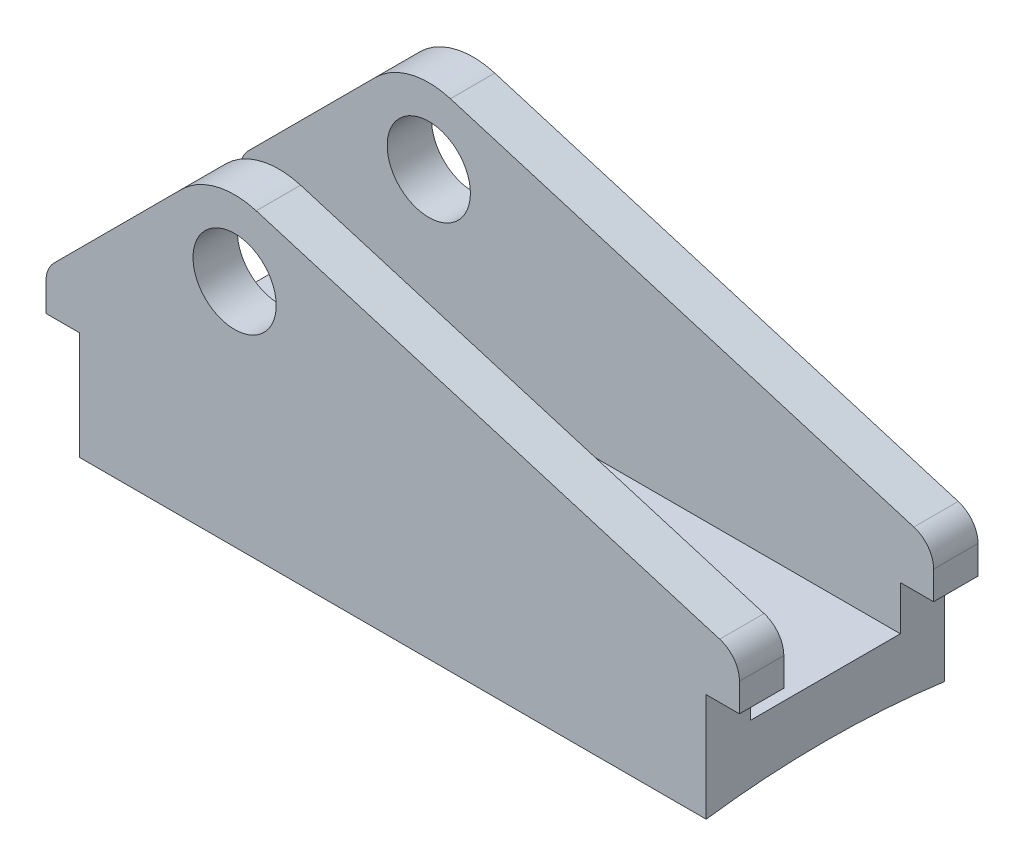
ISO-10303-21;
HEADER;
FILE_DESCRIPTION(('STEP AP214'),'2;1');
FILE_NAME('part.step','',(''),(''),'','','');
FILE_SCHEMA(('AUTOMOTIVE_DESIGN { 1 0 10303 214 1 1 1 1 }'));
ENDSEC;
DATA;
#1=APPLICATION_CONTEXT('core data for automotive mechanical design processes');
#2=APPLICATION_PROTOCOL_DEFINITION('international standard','automotive_design',2000,#1);
#3=PRODUCT_CONTEXT('',#1,'mechanical');
#4=PRODUCT('Part','Part','',(#3));
#5=PRODUCT_RELATED_PRODUCT_CATEGORY('part','',(#4));
#6=PRODUCT_DEFINITION_FORMATION('','',#4);
#7=PRODUCT_DEFINITION_CONTEXT('part definition',#1,'design');
#8=PRODUCT_DEFINITION('design','',#6,#7);
#9=PRODUCT_DEFINITION_SHAPE('','',#8);
#10=(LENGTH_UNIT() NAMED_UNIT(*) SI_UNIT(.MILLI.,.METRE.));
#11=(NAMED_UNIT(*) PLANE_ANGLE_UNIT() SI_UNIT($,.RADIAN.));
#12=(NAMED_UNIT(*) SI_UNIT($,.STERADIAN.) SOLID_ANGLE_UNIT());
#13=UNCERTAINTY_MEASURE_WITH_UNIT(LENGTH_MEASURE(1.E-05),#10,'distance_accuracy_value','');
#14=(GEOMETRIC_REPRESENTATION_CONTEXT(3) GLOBAL_UNCERTAINTY_ASSIGNED_CONTEXT((#13)) GLOBAL_UNIT_ASSIGNED_CONTEXT((#10,
#11,#12)) REPRESENTATION_CONTEXT('',''));
#15=CARTESIAN_POINT('',(0.,0.,0.));
#16=DIRECTION('',(0.,0.,1.));
#17=DIRECTION('',(1.,0.,0.));
#18=AXIS2_PLACEMENT_3D('',#15,#16,#17);
#19=CARTESIAN_POINT('',(56.5,10.,21.5));
#20=DIRECTION('',(-1.,0.,0.));
#21=DIRECTION('',(0.,0.,1.));
#22=AXIS2_PLACEMENT_3D('',#19,#20,#21);
#23=PLANE('',#22);
#24=CARTESIAN_POINT('',(56.5,-160.,0.));
#25=DIRECTION('',(1.,0.,0.));
#26=DIRECTION('',(0.,0.,-1.));
#27=AXIS2_PLACEMENT_3D('',#24,#25,#26);
#28=CIRCLE('',#27,160.);
#29=CARTESIAN_POINT('',(56.5,-1.45111164060469,-21.5));
#30=VERTEX_POINT('',#29);
#31=CARTESIAN_POINT('',(56.5,-1.45111164060469,21.5));
#32=VERTEX_POINT('',#31);
#33=EDGE_CURVE('E54',#30,#32,#28,.T.);
#34=ORIENTED_EDGE('',*,*,#33,.F.);
#35=DIRECTION('',(0.,-1.,0.));
#36=VECTOR('',#35,1.);
#37=CARTESIAN_POINT('',(56.5,10.,-21.5));
#38=LINE('',#37,#36);
#39=CARTESIAN_POINT('',(56.5,18.,-21.5));
#40=VERTEX_POINT('',#39);
#41=EDGE_CURVE('E209',#40,#30,#38,.T.);
#42=ORIENTED_EDGE('',*,*,#41,.F.);
#43=DIRECTION('',(0.,0.,-1.));
#44=VECTOR('',#43,1.);
#45=CARTESIAN_POINT('',(56.5,18.,-13.5));
#46=LINE('',#45,#44);
#47=CARTESIAN_POINT('',(56.5,18.,-13.5));
#48=VERTEX_POINT('',#47);
#49=EDGE_CURVE('E319',#48,#40,#46,.T.);
#50=ORIENTED_EDGE('',*,*,#49,.F.);
#51=DIRECTION('',(0.,1.,0.));
#52=VECTOR('',#51,1.);
#53=CARTESIAN_POINT('',(56.5,0.,-13.5));
#54=LINE('',#53,#52);
#55=CARTESIAN_POINT('',(56.5,10.,-13.5));
#56=VERTEX_POINT('',#55);
#57=EDGE_CURVE('E353',#56,#48,#54,.T.);
#58=ORIENTED_EDGE('',*,*,#57,.F.);
#59=DIRECTION('',(0.,0.,-1.));
#60=VECTOR('',#59,1.);
#61=CARTESIAN_POINT('',(56.5,10.,21.5));
#62=LINE('',#61,#60);
#63=CARTESIAN_POINT('',(56.5,10.,13.5));
#64=VERTEX_POINT('',#63);
#65=EDGE_CURVE('E232',#64,#56,#62,.T.);
#66=ORIENTED_EDGE('',*,*,#65,.F.);
#67=DIRECTION('',(0.,1.,0.));
#68=VECTOR('',#67,1.);
#69=CARTESIAN_POINT('',(56.5,0.,13.5));
#70=LINE('',#69,#68);
#71=CARTESIAN_POINT('',(56.5,18.,13.5));
#72=VERTEX_POINT('',#71);
#73=EDGE_CURVE('E256',#64,#72,#70,.T.);
#74=ORIENTED_EDGE('',*,*,#73,.T.);
#75=DIRECTION('',(0.,0.,1.));
#76=VECTOR('',#75,1.);
#77=CARTESIAN_POINT('',(56.5,18.,13.5));
#78=LINE('',#77,#76);
#79=CARTESIAN_POINT('',(56.5,18.,21.5));
#80=VERTEX_POINT('',#79);
#81=EDGE_CURVE('E231',#72,#80,#78,.T.);
#82=ORIENTED_EDGE('',*,*,#81,.T.);
#83=DIRECTION('',(0.,-1.,0.));
#84=VECTOR('',#83,1.);
#85=CARTESIAN_POINT('',(56.5,10.,21.5));
#86=LINE('',#85,#84);
#87=EDGE_CURVE('E213',#80,#32,#86,.T.);
#88=ORIENTED_EDGE('',*,*,#87,.T.);
#89=EDGE_LOOP('',(#34,#42,#50,#58,#66,#74,#82,#88));
#90=FACE_BOUND('',#89,.T.);
#91=ADVANCED_FACE('F41',(#90),#23,.F.);
#92=CARTESIAN_POINT('',(0.,10.,0.));
#93=DIRECTION('',(0.,-1.,0.));
#94=DIRECTION('',(0.,0.,-1.));
#95=AXIS2_PLACEMENT_3D('',#92,#93,#94);
#96=PLANE('',#95);
#97=DIRECTION('',(1.,0.,0.));
#98=VECTOR('',#97,1.);
#99=CARTESIAN_POINT('',(0.,10.,-13.5));
#100=LINE('',#99,#98);
#101=CARTESIAN_POINT('',(-56.5,10.,-13.5));
#102=VERTEX_POINT('',#101);
#103=EDGE_CURVE('E65',#102,#56,#100,.T.);
#104=ORIENTED_EDGE('',*,*,#103,.F.);
#105=DIRECTION('',(0.,0.,1.));
#106=VECTOR('',#105,1.);
#107=CARTESIAN_POINT('',(-56.5,10.,21.5));
#108=LINE('',#107,#106);
#109=CARTESIAN_POINT('',(-56.5,10.,13.5));
#110=VERTEX_POINT('',#109);
#111=EDGE_CURVE('E227',#102,#110,#108,.T.);
#112=ORIENTED_EDGE('',*,*,#111,.T.);
#113=DIRECTION('',(-1.,0.,0.));
#114=VECTOR('',#113,1.);
#115=CARTESIAN_POINT('',(0.,10.,13.5));
#116=LINE('',#115,#114);
#117=EDGE_CURVE('E48',#64,#110,#116,.T.);
#118=ORIENTED_EDGE('',*,*,#117,.F.);
#119=ORIENTED_EDGE('',*,*,#65,.T.);
#120=EDGE_LOOP('',(#104,#112,#118,#119));
#121=FACE_BOUND('',#120,.T.);
#122=ADVANCED_FACE('F415',(#121),#96,.F.);
#123=CARTESIAN_POINT('',(-56.5,10.,-21.5));
#124=DIRECTION('',(0.,0.,1.));
#125=DIRECTION('',(1.,0.,0.));
#126=AXIS2_PLACEMENT_3D('',#123,#124,#125);
#127=PLANE('',#126);
#128=ORIENTED_EDGE('',*,*,#41,.T.);
#129=DIRECTION('',(1.,0.,0.));
#130=VECTOR('',#129,1.);
#131=CARTESIAN_POINT('',(-62.5,-1.45111164060469,-21.5));
#132=LINE('',#131,#130);
#133=CARTESIAN_POINT('',(-56.5,-1.45111164060469,-21.5));
#134=VERTEX_POINT('',#133);
#135=EDGE_CURVE('E196',#30,#134,#132,.F.);
#136=ORIENTED_EDGE('',*,*,#135,.T.);
#137=DIRECTION('',(0.,-1.,0.));
#138=VECTOR('',#137,1.);
#139=CARTESIAN_POINT('',(-56.5,10.,-21.5));
#140=LINE('',#139,#138);
#141=CARTESIAN_POINT('',(-56.5,18.,-21.5));
#142=VERTEX_POINT('',#141);
#143=EDGE_CURVE('E219',#142,#134,#140,.T.);
#144=ORIENTED_EDGE('',*,*,#143,.F.);
#145=DIRECTION('',(1.,0.,0.));
#146=VECTOR('',#145,1.);
#147=CARTESIAN_POINT('',(-56.5,18.,-21.5));
#148=LINE('',#147,#146);
#149=CARTESIAN_POINT('',(-62.5,18.,-21.5));
#150=VERTEX_POINT('',#149);
#151=EDGE_CURVE('E368',#150,#142,#148,.T.);
#152=ORIENTED_EDGE('',*,*,#151,.F.);
#153=DIRECTION('',(0.,-1.,0.));
#154=VECTOR('',#153,1.);
#155=CARTESIAN_POINT('',(-62.5,18.,-21.5));
#156=LINE('',#155,#154);
#157=CARTESIAN_POINT('',(-62.5,23.0915259582902,-21.5));
#158=VERTEX_POINT('',#157);
#159=EDGE_CURVE('E365',#158,#150,#156,.T.);
#160=ORIENTED_EDGE('',*,*,#159,.F.);
#161=CARTESIAN_POINT('',(-57.5,23.0915259582902,-21.5));
#162=DIRECTION('',(0.,0.,1.));
#163=DIRECTION('',(1.,0.,0.));
#164=AXIS2_PLACEMENT_3D('',#161,#162,#163);
#165=CIRCLE('',#164,5.);
#166=CARTESIAN_POINT('',(-61.0355339059327,26.6270598642229,-21.5));
#167=VERTEX_POINT('',#166);
#168=EDGE_CURVE('E362',#167,#158,#165,.T.);
#169=ORIENTED_EDGE('',*,*,#168,.F.);
#170=DIRECTION('',(-0.707106781186551,-0.707106781186544,0.));
#171=VECTOR('',#170,1.);
#172=CARTESIAN_POINT('',(-61.0355339059327,26.6270598642229,-21.5));
#173=LINE('',#172,#171);
#174=CARTESIAN_POINT('',(-38.0812968850776,49.5812968850777,-21.5));
#175=VERTEX_POINT('',#174);
#176=EDGE_CURVE('E358',#175,#167,#173,.T.);
#177=ORIENTED_EDGE('',*,*,#176,.F.);
#178=CARTESIAN_POINT('',(-28.5,40.,-21.5));
#179=DIRECTION('',(0.,0.,1.));
#180=DIRECTION('',(-1.,0.,0.));
#181=AXIS2_PLACEMENT_3D('',#178,#179,#180);
#182=CIRCLE('',#181,13.55);
#183=CARTESIAN_POINT('',(-24.6014576766685,52.9770515816649,-21.5));
#184=VERTEX_POINT('',#183);
#185=EDGE_CURVE('E359',#184,#175,#182,.T.);
#186=ORIENTED_EDGE('',*,*,#185,.F.);
#187=DIRECTION('',(-0.957715983886712,0.287715300614872,0.));
#188=VECTOR('',#187,1.);
#189=CARTESIAN_POINT('',(58.9385765030744,27.8801058777238,-21.5));
#190=LINE('',#189,#188);
#191=CARTESIAN_POINT('',(58.9385765030744,27.8801058777238,-21.5));
#192=VERTEX_POINT('',#191);
#193=EDGE_CURVE('E357',#192,#184,#190,.T.);
#194=ORIENTED_EDGE('',*,*,#193,.F.);
#195=CARTESIAN_POINT('',(57.5,23.0915259582902,-21.5));
#196=DIRECTION('',(0.,0.,1.));
#197=DIRECTION('',(1.,0.,0.));
#198=AXIS2_PLACEMENT_3D('',#195,#196,#197);
#199=CIRCLE('',#198,4.99999999999999);
#200=CARTESIAN_POINT('',(62.5,23.0915259582902,-21.5));
#201=VERTEX_POINT('',#200);
#202=EDGE_CURVE('E352',#201,#192,#199,.T.);
#203=ORIENTED_EDGE('',*,*,#202,.F.);
#204=DIRECTION('',(0.,1.,0.));
#205=VECTOR('',#204,1.);
#206=CARTESIAN_POINT('',(62.5,18.,-21.5));
#207=LINE('',#206,#205);
#208=CARTESIAN_POINT('',(62.5,18.,-21.5));
#209=VERTEX_POINT('',#208);
#210=EDGE_CURVE('E355',#209,#201,#207,.T.);
#211=ORIENTED_EDGE('',*,*,#210,.F.);
#212=DIRECTION('',(1.,0.,0.));
#213=VECTOR('',#212,1.);
#214=CARTESIAN_POINT('',(56.5,18.,-21.5));
#215=LINE('',#214,#213);
#216=EDGE_CURVE('E217',#40,#209,#215,.T.);
#217=ORIENTED_EDGE('',*,*,#216,.F.);
#218=EDGE_LOOP('',(#128,#136,#144,#152,#160,#169,#177,#186,#194,#203,#211,#217));
#219=FACE_BOUND('',#218,.T.);
#220=CARTESIAN_POINT('',(-28.5,40.,-21.5));
#221=DIRECTION('',(0.,0.,1.));
#222=DIRECTION('',(1.,0.,0.));
#223=AXIS2_PLACEMENT_3D('',#220,#221,#222);
#224=CIRCLE('',#223,7.5);
#225=CARTESIAN_POINT('',(-21.,40.,-21.5));
#226=VERTEX_POINT('',#225);
#227=EDGE_CURVE('E202',#226,#226,#224,.T.);
#228=ORIENTED_EDGE('',*,*,#227,.T.);
#229=EDGE_LOOP('',(#228));
#230=FACE_BOUND('',#229,.T.);
#231=ADVANCED_FACE('F214',(#219,#230),#127,.F.);
#232=CARTESIAN_POINT('',(-56.5,10.,21.5));
#233=DIRECTION('',(1.,0.,0.));
#234=DIRECTION('',(0.,0.,-1.));
#235=AXIS2_PLACEMENT_3D('',#232,#233,#234);
#236=PLANE('',#235);
#237=ORIENTED_EDGE('',*,*,#143,.T.);
#238=CARTESIAN_POINT('',(-56.5,-160.,0.));
#239=DIRECTION('',(1.,0.,0.));
#240=DIRECTION('',(0.,0.,-1.));
#241=AXIS2_PLACEMENT_3D('',#238,#239,#240);
#242=CIRCLE('',#241,160.);
#243=CARTESIAN_POINT('',(-56.5,-1.45111164060469,21.5));
#244=VERTEX_POINT('',#243);
#245=EDGE_CURVE('E203',#134,#244,#242,.T.);
#246=ORIENTED_EDGE('',*,*,#245,.T.);
#247=DIRECTION('',(0.,-1.,0.));
#248=VECTOR('',#247,1.);
#249=CARTESIAN_POINT('',(-56.5,10.,21.5));
#250=LINE('',#249,#248);
#251=CARTESIAN_POINT('',(-56.5,18.,21.5));
#252=VERTEX_POINT('',#251);
#253=EDGE_CURVE('E224',#252,#244,#250,.T.);
#254=ORIENTED_EDGE('',*,*,#253,.F.);
#255=DIRECTION('',(0.,0.,1.));
#256=VECTOR('',#255,1.);
#257=CARTESIAN_POINT('',(-56.5,18.,13.5));
#258=LINE('',#257,#256);
#259=CARTESIAN_POINT('',(-56.5,18.,13.5));
#260=VERTEX_POINT('',#259);
#261=EDGE_CURVE('E234',#260,#252,#258,.T.);
#262=ORIENTED_EDGE('',*,*,#261,.F.);
#263=DIRECTION('',(0.,-1.,0.));
#264=VECTOR('',#263,1.);
#265=CARTESIAN_POINT('',(-56.5,0.,13.5));
#266=LINE('',#265,#264);
#267=EDGE_CURVE('E240',#260,#110,#266,.T.);
#268=ORIENTED_EDGE('',*,*,#267,.T.);
#269=ORIENTED_EDGE('',*,*,#111,.F.);
#270=DIRECTION('',(0.,-1.,0.));
#271=VECTOR('',#270,1.);
#272=CARTESIAN_POINT('',(-56.5,0.,-13.5));
#273=LINE('',#272,#271);
#274=CARTESIAN_POINT('',(-56.5,18.,-13.5));
#275=VERTEX_POINT('',#274);
#276=EDGE_CURVE('E390',#275,#102,#273,.T.);
#277=ORIENTED_EDGE('',*,*,#276,.F.);
#278=DIRECTION('',(0.,0.,-1.));
#279=VECTOR('',#278,1.);
#280=CARTESIAN_POINT('',(-56.5,18.,-13.5));
#281=LINE('',#280,#279);
#282=EDGE_CURVE('E321',#275,#142,#281,.T.);
#283=ORIENTED_EDGE('',*,*,#282,.T.);
#284=EDGE_LOOP('',(#237,#246,#254,#262,#268,#269,#277,#283));
#285=FACE_BOUND('',#284,.T.);
#286=ADVANCED_FACE('F397',(#285),#236,.F.);
#287=CARTESIAN_POINT('',(-56.5,10.,21.5));
#288=DIRECTION('',(0.,0.,-1.));
#289=DIRECTION('',(-1.,0.,0.));
#290=AXIS2_PLACEMENT_3D('',#287,#288,#289);
#291=PLANE('',#290);
#292=ORIENTED_EDGE('',*,*,#253,.T.);
#293=DIRECTION('',(1.,0.,0.));
#294=VECTOR('',#293,1.);
#295=CARTESIAN_POINT('',(-62.5,-1.45111164060469,21.5));
#296=LINE('',#295,#294);
#297=EDGE_CURVE('E11',#244,#32,#296,.T.);
#298=ORIENTED_EDGE('',*,*,#297,.T.);
#299=ORIENTED_EDGE('',*,*,#87,.F.);
#300=DIRECTION('',(1.,0.,0.));
#301=VECTOR('',#300,1.);
#302=CARTESIAN_POINT('',(56.5,18.,21.5));
#303=LINE('',#302,#301);
#304=CARTESIAN_POINT('',(62.5,18.,21.5));
#305=VERTEX_POINT('',#304);
#306=EDGE_CURVE('E278',#80,#305,#303,.T.);
#307=ORIENTED_EDGE('',*,*,#306,.T.);
#308=DIRECTION('',(0.,1.,0.));
#309=VECTOR('',#308,1.);
#310=CARTESIAN_POINT('',(62.5,18.,21.5));
#311=LINE('',#310,#309);
#312=CARTESIAN_POINT('',(62.5,23.0915259582902,21.5));
#313=VERTEX_POINT('',#312);
#314=EDGE_CURVE('E280',#305,#313,#311,.T.);
#315=ORIENTED_EDGE('',*,*,#314,.T.);
#316=CARTESIAN_POINT('',(57.5,23.0915259582902,21.5));
#317=DIRECTION('',(0.,0.,1.));
#318=DIRECTION('',(1.,0.,0.));
#319=AXIS2_PLACEMENT_3D('',#316,#317,#318);
#320=CIRCLE('',#319,4.99999999999999);
#321=CARTESIAN_POINT('',(58.9385765030744,27.8801058777238,21.5));
#322=VERTEX_POINT('',#321);
#323=EDGE_CURVE('E273',#313,#322,#320,.T.);
#324=ORIENTED_EDGE('',*,*,#323,.T.);
#325=DIRECTION('',(-0.957715983886712,0.287715300614872,0.));
#326=VECTOR('',#325,1.);
#327=CARTESIAN_POINT('',(58.9385765030744,27.8801058777238,21.5));
#328=LINE('',#327,#326);
#329=CARTESIAN_POINT('',(-24.6014576766685,52.9770515816649,21.5));
#330=VERTEX_POINT('',#329);
#331=EDGE_CURVE('E271',#322,#330,#328,.T.);
#332=ORIENTED_EDGE('',*,*,#331,.T.);
#333=CARTESIAN_POINT('',(-28.5,40.,21.5));
#334=DIRECTION('',(0.,0.,1.));
#335=DIRECTION('',(-1.,0.,0.));
#336=AXIS2_PLACEMENT_3D('',#333,#334,#335);
#337=CIRCLE('',#336,13.55);
#338=CARTESIAN_POINT('',(-38.0812968850776,49.5812968850777,21.5));
#339=VERTEX_POINT('',#338);
#340=EDGE_CURVE('E268',#330,#339,#337,.T.);
#341=ORIENTED_EDGE('',*,*,#340,.T.);
#342=DIRECTION('',(-0.707106781186551,-0.707106781186544,0.));
#343=VECTOR('',#342,1.);
#344=CARTESIAN_POINT('',(-61.0355339059327,26.6270598642229,21.5));
#345=LINE('',#344,#343);
#346=CARTESIAN_POINT('',(-61.0355339059327,26.6270598642229,21.5));
#347=VERTEX_POINT('',#346);
#348=EDGE_CURVE('E264',#339,#347,#345,.T.);
#349=ORIENTED_EDGE('',*,*,#348,.T.);
#350=CARTESIAN_POINT('',(-57.5,23.0915259582902,21.5));
#351=DIRECTION('',(0.,0.,1.));
#352=DIRECTION('',(1.,0.,0.));
#353=AXIS2_PLACEMENT_3D('',#350,#351,#352);
#354=CIRCLE('',#353,5.);
#355=CARTESIAN_POINT('',(-62.5,23.0915259582902,21.5));
#356=VERTEX_POINT('',#355);
#357=EDGE_CURVE('E265',#347,#356,#354,.T.);
#358=ORIENTED_EDGE('',*,*,#357,.T.);
#359=DIRECTION('',(0.,-1.,0.));
#360=VECTOR('',#359,1.);
#361=CARTESIAN_POINT('',(-62.5,18.,21.5));
#362=LINE('',#361,#360);
#363=CARTESIAN_POINT('',(-62.5,18.,21.5));
#364=VERTEX_POINT('',#363);
#365=EDGE_CURVE('E259',#356,#364,#362,.T.);
#366=ORIENTED_EDGE('',*,*,#365,.T.);
#367=DIRECTION('',(1.,0.,0.));
#368=VECTOR('',#367,1.);
#369=CARTESIAN_POINT('',(-56.5,18.,21.5));
#370=LINE('',#369,#368);
#371=EDGE_CURVE('E254',#364,#252,#370,.T.);
#372=ORIENTED_EDGE('',*,*,#371,.T.);
#373=EDGE_LOOP('',(#292,#298,#299,#307,#315,#324,#332,#341,#349,#358,#366,#372));
#374=FACE_BOUND('',#373,.T.);
#375=CARTESIAN_POINT('',(-28.5,40.,21.5));
#376=DIRECTION('',(0.,0.,1.));
#377=DIRECTION('',(1.,0.,0.));
#378=AXIS2_PLACEMENT_3D('',#375,#376,#377);
#379=CIRCLE('',#378,7.5);
#380=CARTESIAN_POINT('',(-21.,40.,21.5));
#381=VERTEX_POINT('',#380);
#382=EDGE_CURVE('E314',#381,#381,#379,.T.);
#383=ORIENTED_EDGE('',*,*,#382,.F.);
#384=EDGE_LOOP('',(#383));
#385=FACE_BOUND('',#384,.T.);
#386=ADVANCED_FACE('F399',(#374,#385),#291,.F.);
#387=CARTESIAN_POINT('',(57.5,23.0915259582902,13.5));
#388=DIRECTION('',(0.,0.,1.));
#389=DIRECTION('',(1.,0.,0.));
#390=AXIS2_PLACEMENT_3D('',#387,#388,#389);
#391=PLANE('',#390);
#392=CARTESIAN_POINT('',(-28.5,40.,13.5));
#393=DIRECTION('',(0.,0.,1.));
#394=DIRECTION('',(1.,0.,0.));
#395=AXIS2_PLACEMENT_3D('',#392,#393,#394);
#396=CIRCLE('',#395,7.5);
#397=CARTESIAN_POINT('',(-21.,40.,13.5));
#398=VERTEX_POINT('',#397);
#399=EDGE_CURVE('E281',#398,#398,#396,.T.);
#400=ORIENTED_EDGE('',*,*,#399,.T.);
#401=EDGE_LOOP('',(#400));
#402=FACE_BOUND('',#401,.T.);
#403=ORIENTED_EDGE('',*,*,#73,.F.);
#404=ORIENTED_EDGE('',*,*,#117,.T.);
#405=ORIENTED_EDGE('',*,*,#267,.F.);
#406=DIRECTION('',(1.,0.,0.));
#407=VECTOR('',#406,1.);
#408=CARTESIAN_POINT('',(-56.5,18.,13.5));
#409=LINE('',#408,#407);
#410=CARTESIAN_POINT('',(-62.5,18.,13.5));
#411=VERTEX_POINT('',#410);
#412=EDGE_CURVE('E287',#411,#260,#409,.T.);
#413=ORIENTED_EDGE('',*,*,#412,.F.);
#414=DIRECTION('',(0.,-1.,0.));
#415=VECTOR('',#414,1.);
#416=CARTESIAN_POINT('',(-62.5,18.,13.5));
#417=LINE('',#416,#415);
#418=CARTESIAN_POINT('',(-62.5,23.0915259582902,13.5));
#419=VERTEX_POINT('',#418);
#420=EDGE_CURVE('E286',#419,#411,#417,.T.);
#421=ORIENTED_EDGE('',*,*,#420,.F.);
#422=CARTESIAN_POINT('',(-57.5,23.0915259582902,13.5));
#423=DIRECTION('',(0.,0.,1.));
#424=DIRECTION('',(1.,0.,0.));
#425=AXIS2_PLACEMENT_3D('',#422,#423,#424);
#426=CIRCLE('',#425,5.);
#427=CARTESIAN_POINT('',(-61.0355339059327,26.6270598642229,13.5));
#428=VERTEX_POINT('',#427);
#429=EDGE_CURVE('E295',#428,#419,#426,.T.);
#430=ORIENTED_EDGE('',*,*,#429,.F.);
#431=DIRECTION('',(-0.707106781186551,-0.707106781186544,0.));
#432=VECTOR('',#431,1.);
#433=CARTESIAN_POINT('',(-61.0355339059327,26.6270598642229,13.5));
#434=LINE('',#433,#432);
#435=CARTESIAN_POINT('',(-38.0812968850776,49.5812968850777,13.5));
#436=VERTEX_POINT('',#435);
#437=EDGE_CURVE('E293',#436,#428,#434,.T.);
#438=ORIENTED_EDGE('',*,*,#437,.F.);
#439=CARTESIAN_POINT('',(-28.5,40.,13.5));
#440=DIRECTION('',(0.,0.,1.));
#441=DIRECTION('',(-1.,0.,0.));
#442=AXIS2_PLACEMENT_3D('',#439,#440,#441);
#443=CIRCLE('',#442,13.55);
#444=CARTESIAN_POINT('',(-24.6014576766685,52.9770515816649,13.5));
#445=VERTEX_POINT('',#444);
#446=EDGE_CURVE('E296',#445,#436,#443,.T.);
#447=ORIENTED_EDGE('',*,*,#446,.F.);
#448=DIRECTION('',(-0.957715983886712,0.287715300614872,0.));
#449=VECTOR('',#448,1.);
#450=CARTESIAN_POINT('',(58.9385765030744,27.8801058777238,13.5));
#451=LINE('',#450,#449);
#452=CARTESIAN_POINT('',(58.9385765030744,27.8801058777238,13.5));
#453=VERTEX_POINT('',#452);
#454=EDGE_CURVE('E302',#453,#445,#451,.T.);
#455=ORIENTED_EDGE('',*,*,#454,.F.);
#456=CARTESIAN_POINT('',(57.5,23.0915259582902,13.5));
#457=DIRECTION('',(0.,0.,1.));
#458=DIRECTION('',(1.,0.,0.));
#459=AXIS2_PLACEMENT_3D('',#456,#457,#458);
#460=CIRCLE('',#459,4.99999999999999);
#461=CARTESIAN_POINT('',(62.5,23.0915259582902,13.5));
#462=VERTEX_POINT('',#461);
#463=EDGE_CURVE('E301',#462,#453,#460,.T.);
#464=ORIENTED_EDGE('',*,*,#463,.F.);
#465=DIRECTION('',(0.,1.,0.));
#466=VECTOR('',#465,1.);
#467=CARTESIAN_POINT('',(62.5,18.,13.5));
#468=LINE('',#467,#466);
#469=CARTESIAN_POINT('',(62.5,18.,13.5));
#470=VERTEX_POINT('',#469);
#471=EDGE_CURVE('E307',#470,#462,#468,.T.);
#472=ORIENTED_EDGE('',*,*,#471,.F.);
#473=DIRECTION('',(1.,0.,0.));
#474=VECTOR('',#473,1.);
#475=CARTESIAN_POINT('',(56.5,18.,13.5));
#476=LINE('',#475,#474);
#477=EDGE_CURVE('E309',#72,#470,#476,.T.);
#478=ORIENTED_EDGE('',*,*,#477,.F.);
#479=EDGE_LOOP('',(#403,#404,#405,#413,#421,#430,#438,#447,#455,#464,#472,#478));
#480=FACE_BOUND('',#479,.T.);
#481=ADVANCED_FACE('F406',(#402,#480),#391,.F.);
#482=CARTESIAN_POINT('',(-56.5,18.,13.5));
#483=DIRECTION('',(0.,-1.,0.));
#484=DIRECTION('',(0.,0.,-1.));
#485=AXIS2_PLACEMENT_3D('',#482,#483,#484);
#486=PLANE('',#485);
#487=ORIENTED_EDGE('',*,*,#371,.F.);
#488=DIRECTION('',(0.,0.,1.));
#489=VECTOR('',#488,1.);
#490=CARTESIAN_POINT('',(-62.5,18.,13.5));
#491=LINE('',#490,#489);
#492=EDGE_CURVE('E253',#411,#364,#491,.T.);
#493=ORIENTED_EDGE('',*,*,#492,.F.);
#494=ORIENTED_EDGE('',*,*,#412,.T.);
#495=ORIENTED_EDGE('',*,*,#261,.T.);
#496=EDGE_LOOP('',(#487,#493,#494,#495));
#497=FACE_BOUND('',#496,.T.);
#498=ADVANCED_FACE('F401',(#497),#486,.T.);
#499=CARTESIAN_POINT('',(-62.5,18.,13.5));
#500=DIRECTION('',(-1.,0.,0.));
#501=DIRECTION('',(0.,0.,1.));
#502=AXIS2_PLACEMENT_3D('',#499,#500,#501);
#503=PLANE('',#502);
#504=ORIENTED_EDGE('',*,*,#365,.F.);
#505=DIRECTION('',(0.,0.,1.));
#506=VECTOR('',#505,1.);
#507=CARTESIAN_POINT('',(-62.5,23.0915259582902,13.5));
#508=LINE('',#507,#506);
#509=EDGE_CURVE('E246',#419,#356,#508,.T.);
#510=ORIENTED_EDGE('',*,*,#509,.F.);
#511=ORIENTED_EDGE('',*,*,#420,.T.);
#512=ORIENTED_EDGE('',*,*,#492,.T.);
#513=EDGE_LOOP('',(#504,#510,#511,#512));
#514=FACE_BOUND('',#513,.T.);
#515=ADVANCED_FACE('F656',(#514),#503,.T.);
#516=CARTESIAN_POINT('',(-57.5,23.0915259582902,13.5));
#517=DIRECTION('',(0.,0.,1.));
#518=DIRECTION('',(1.,0.,0.));
#519=AXIS2_PLACEMENT_3D('',#516,#517,#518);
#520=CYLINDRICAL_SURFACE('',#519,5.);
#521=ORIENTED_EDGE('',*,*,#357,.F.);
#522=DIRECTION('',(0.,0.,1.));
#523=VECTOR('',#522,1.);
#524=CARTESIAN_POINT('',(-61.0355339059327,26.6270598642229,13.5));
#525=LINE('',#524,#523);
#526=EDGE_CURVE('E250',#428,#347,#525,.T.);
#527=ORIENTED_EDGE('',*,*,#526,.F.);
#528=ORIENTED_EDGE('',*,*,#429,.T.);
#529=ORIENTED_EDGE('',*,*,#509,.T.);
#530=EDGE_LOOP('',(#521,#527,#528,#529));
#531=FACE_BOUND('',#530,.T.);
#532=ADVANCED_FACE('F650',(#531),#520,.T.);
#533=CARTESIAN_POINT('',(-61.0355339059327,26.6270598642229,13.5));
#534=DIRECTION('',(-0.707106781186544,0.707106781186551,0.));
#535=DIRECTION('',(-0.707106781186551,-0.707106781186544,0.));
#536=AXIS2_PLACEMENT_3D('',#533,#534,#535);
#537=PLANE('',#536);
#538=ORIENTED_EDGE('',*,*,#348,.F.);
#539=DIRECTION('',(0.,0.,1.));
#540=VECTOR('',#539,1.);
#541=CARTESIAN_POINT('',(-38.0812968850776,49.5812968850777,13.5));
#542=LINE('',#541,#540);
#543=EDGE_CURVE('E244',#436,#339,#542,.T.);
#544=ORIENTED_EDGE('',*,*,#543,.F.);
#545=ORIENTED_EDGE('',*,*,#437,.T.);
#546=ORIENTED_EDGE('',*,*,#526,.T.);
#547=EDGE_LOOP('',(#538,#544,#545,#546));
#548=FACE_BOUND('',#547,.T.);
#549=ADVANCED_FACE('F636',(#548),#537,.T.);
#550=CARTESIAN_POINT('',(-28.5,40.,13.5));
#551=DIRECTION('',(0.,0.,1.));
#552=DIRECTION('',(1.,0.,0.));
#553=AXIS2_PLACEMENT_3D('',#550,#551,#552);
#554=CYLINDRICAL_SURFACE('',#553,13.55);
#555=ORIENTED_EDGE('',*,*,#340,.F.);
#556=DIRECTION('',(0.,0.,1.));
#557=VECTOR('',#556,1.);
#558=CARTESIAN_POINT('',(-24.6014576766685,52.9770515816649,13.5));
#559=LINE('',#558,#557);
#560=EDGE_CURVE('E241',#445,#330,#559,.T.);
#561=ORIENTED_EDGE('',*,*,#560,.F.);
#562=ORIENTED_EDGE('',*,*,#446,.T.);
#563=ORIENTED_EDGE('',*,*,#543,.T.);
#564=EDGE_LOOP('',(#555,#561,#562,#563));
#565=FACE_BOUND('',#564,.T.);
#566=ADVANCED_FACE('F627',(#565),#554,.T.);
#567=CARTESIAN_POINT('',(58.9385765030744,27.8801058777238,13.5));
#568=DIRECTION('',(0.287715300614872,0.957715983886713,0.));
#569=DIRECTION('',(-0.957715983886713,0.287715300614872,0.));
#570=AXIS2_PLACEMENT_3D('',#567,#568,#569);
#571=PLANE('',#570);
#572=ORIENTED_EDGE('',*,*,#331,.F.);
#573=DIRECTION('',(0.,0.,1.));
#574=VECTOR('',#573,1.);
#575=CARTESIAN_POINT('',(58.9385765030744,27.8801058777238,13.5));
#576=LINE('',#575,#574);
#577=EDGE_CURVE('E243',#453,#322,#576,.T.);
#578=ORIENTED_EDGE('',*,*,#577,.F.);
#579=ORIENTED_EDGE('',*,*,#454,.T.);
#580=ORIENTED_EDGE('',*,*,#560,.T.);
#581=EDGE_LOOP('',(#572,#578,#579,#580));
#582=FACE_BOUND('',#581,.T.);
#583=ADVANCED_FACE('F618',(#582),#571,.T.);
#584=CARTESIAN_POINT('',(57.5,23.0915259582902,13.5));
#585=DIRECTION('',(0.,0.,1.));
#586=DIRECTION('',(1.,0.,0.));
#587=AXIS2_PLACEMENT_3D('',#584,#585,#586);
#588=CYLINDRICAL_SURFACE('',#587,4.99999999999999);
#589=ORIENTED_EDGE('',*,*,#323,.F.);
#590=DIRECTION('',(0.,0.,1.));
#591=VECTOR('',#590,1.);
#592=CARTESIAN_POINT('',(62.5,23.0915259582902,13.5));
#593=LINE('',#592,#591);
#594=EDGE_CURVE('E239',#462,#313,#593,.T.);
#595=ORIENTED_EDGE('',*,*,#594,.F.);
#596=ORIENTED_EDGE('',*,*,#463,.T.);
#597=ORIENTED_EDGE('',*,*,#577,.T.);
#598=EDGE_LOOP('',(#589,#595,#596,#597));
#599=FACE_BOUND('',#598,.T.);
#600=ADVANCED_FACE('F615',(#599),#588,.T.);
#601=CARTESIAN_POINT('',(62.5,18.,13.5));
#602=DIRECTION('',(1.,0.,0.));
#603=DIRECTION('',(0.,0.,-1.));
#604=AXIS2_PLACEMENT_3D('',#601,#602,#603);
#605=PLANE('',#604);
#606=ORIENTED_EDGE('',*,*,#314,.F.);
#607=DIRECTION('',(0.,0.,1.));
#608=VECTOR('',#607,1.);
#609=CARTESIAN_POINT('',(62.5,18.,13.5));
#610=LINE('',#609,#608);
#611=EDGE_CURVE('E237',#470,#305,#610,.T.);
#612=ORIENTED_EDGE('',*,*,#611,.F.);
#613=ORIENTED_EDGE('',*,*,#471,.T.);
#614=ORIENTED_EDGE('',*,*,#594,.T.);
#615=EDGE_LOOP('',(#606,#612,#613,#614));
#616=FACE_BOUND('',#615,.T.);
#617=ADVANCED_FACE('F603',(#616),#605,.T.);
#618=CARTESIAN_POINT('',(56.5,18.,13.5));
#619=DIRECTION('',(0.,-1.,0.));
#620=DIRECTION('',(0.,0.,-1.));
#621=AXIS2_PLACEMENT_3D('',#618,#619,#620);
#622=PLANE('',#621);
#623=ORIENTED_EDGE('',*,*,#306,.F.);
#624=ORIENTED_EDGE('',*,*,#81,.F.);
#625=ORIENTED_EDGE('',*,*,#477,.T.);
#626=ORIENTED_EDGE('',*,*,#611,.T.);
#627=EDGE_LOOP('',(#623,#624,#625,#626));
#628=FACE_BOUND('',#627,.T.);
#629=ADVANCED_FACE('F482',(#628),#622,.T.);
#630=CARTESIAN_POINT('',(-28.5,40.,13.5));
#631=DIRECTION('',(0.,0.,1.));
#632=DIRECTION('',(1.,0.,0.));
#633=AXIS2_PLACEMENT_3D('',#630,#631,#632);
#634=CYLINDRICAL_SURFACE('',#633,7.5);
#635=ORIENTED_EDGE('',*,*,#399,.F.);
#636=EDGE_LOOP('',(#635));
#637=FACE_BOUND('',#636,.T.);
#638=ORIENTED_EDGE('',*,*,#382,.T.);
#639=EDGE_LOOP('',(#638));
#640=FACE_BOUND('',#639,.T.);
#641=ADVANCED_FACE('F584',(#637,#640),#634,.F.);
#642=CARTESIAN_POINT('',(57.5,23.0915259582902,-13.5));
#643=DIRECTION('',(0.,0.,-1.));
#644=DIRECTION('',(1.,0.,0.));
#645=AXIS2_PLACEMENT_3D('',#642,#643,#644);
#646=PLANE('',#645);
#647=CARTESIAN_POINT('',(-28.5,40.,-13.5));
#648=DIRECTION('',(0.,0.,1.));
#649=DIRECTION('',(1.,0.,0.));
#650=AXIS2_PLACEMENT_3D('',#647,#648,#649);
#651=CIRCLE('',#650,7.5);
#652=CARTESIAN_POINT('',(-21.,40.,-13.5));
#653=VERTEX_POINT('',#652);
#654=EDGE_CURVE('E369',#653,#653,#651,.T.);
#655=ORIENTED_EDGE('',*,*,#654,.F.);
#656=EDGE_LOOP('',(#655));
#657=FACE_BOUND('',#656,.T.);
#658=ORIENTED_EDGE('',*,*,#276,.T.);
#659=ORIENTED_EDGE('',*,*,#103,.T.);
#660=ORIENTED_EDGE('',*,*,#57,.T.);
#661=DIRECTION('',(1.,0.,0.));
#662=VECTOR('',#661,1.);
#663=CARTESIAN_POINT('',(56.5,18.,-13.5));
#664=LINE('',#663,#662);
#665=CARTESIAN_POINT('',(62.5,18.,-13.5));
#666=VERTEX_POINT('',#665);
#667=EDGE_CURVE('E324',#48,#666,#664,.T.);
#668=ORIENTED_EDGE('',*,*,#667,.T.);
#669=DIRECTION('',(0.,1.,0.));
#670=VECTOR('',#669,1.);
#671=CARTESIAN_POINT('',(62.5,18.,-13.5));
#672=LINE('',#671,#670);
#673=CARTESIAN_POINT('',(62.5,23.0915259582902,-13.5));
#674=VERTEX_POINT('',#673);
#675=EDGE_CURVE('E371',#666,#674,#672,.T.);
#676=ORIENTED_EDGE('',*,*,#675,.T.);
#677=CARTESIAN_POINT('',(57.5,23.0915259582902,-13.5));
#678=DIRECTION('',(0.,0.,1.));
#679=DIRECTION('',(1.,0.,0.));
#680=AXIS2_PLACEMENT_3D('',#677,#678,#679);
#681=CIRCLE('',#680,4.99999999999999);
#682=CARTESIAN_POINT('',(58.9385765030744,27.8801058777238,-13.5));
#683=VERTEX_POINT('',#682);
#684=EDGE_CURVE('E373',#674,#683,#681,.T.);
#685=ORIENTED_EDGE('',*,*,#684,.T.);
#686=DIRECTION('',(-0.957715983886712,0.287715300614872,0.));
#687=VECTOR('',#686,1.);
#688=CARTESIAN_POINT('',(58.9385765030744,27.8801058777238,-13.5));
#689=LINE('',#688,#687);
#690=CARTESIAN_POINT('',(-24.6014576766685,52.9770515816649,-13.5));
#691=VERTEX_POINT('',#690);
#692=EDGE_CURVE('E374',#683,#691,#689,.T.);
#693=ORIENTED_EDGE('',*,*,#692,.T.);
#694=CARTESIAN_POINT('',(-28.5,40.,-13.5));
#695=DIRECTION('',(0.,0.,1.));
#696=DIRECTION('',(-1.,0.,0.));
#697=AXIS2_PLACEMENT_3D('',#694,#695,#696);
#698=CIRCLE('',#697,13.55);
#699=CARTESIAN_POINT('',(-38.0812968850776,49.5812968850777,-13.5));
#700=VERTEX_POINT('',#699);
#701=EDGE_CURVE('E380',#691,#700,#698,.T.);
#702=ORIENTED_EDGE('',*,*,#701,.T.);
#703=DIRECTION('',(-0.707106781186551,-0.707106781186544,0.));
#704=VECTOR('',#703,1.);
#705=CARTESIAN_POINT('',(-61.0355339059327,26.6270598642229,-13.5));
#706=LINE('',#705,#704);
#707=CARTESIAN_POINT('',(-61.0355339059327,26.6270598642229,-13.5));
#708=VERTEX_POINT('',#707);
#709=EDGE_CURVE('E377',#700,#708,#706,.T.);
#710=ORIENTED_EDGE('',*,*,#709,.T.);
#711=CARTESIAN_POINT('',(-57.5,23.0915259582902,-13.5));
#712=DIRECTION('',(0.,0.,1.));
#713=DIRECTION('',(1.,0.,0.));
#714=AXIS2_PLACEMENT_3D('',#711,#712,#713);
#715=CIRCLE('',#714,5.);
#716=CARTESIAN_POINT('',(-62.5,23.0915259582902,-13.5));
#717=VERTEX_POINT('',#716);
#718=EDGE_CURVE('E381',#708,#717,#715,.T.);
#719=ORIENTED_EDGE('',*,*,#718,.T.);
#720=DIRECTION('',(0.,-1.,0.));
#721=VECTOR('',#720,1.);
#722=CARTESIAN_POINT('',(-62.5,18.,-13.5));
#723=LINE('',#722,#721);
#724=CARTESIAN_POINT('',(-62.5,18.,-13.5));
#725=VERTEX_POINT('',#724);
#726=EDGE_CURVE('E382',#717,#725,#723,.T.);
#727=ORIENTED_EDGE('',*,*,#726,.T.);
#728=DIRECTION('',(1.,0.,0.));
#729=VECTOR('',#728,1.);
#730=CARTESIAN_POINT('',(-56.5,18.,-13.5));
#731=LINE('',#730,#729);
#732=EDGE_CURVE('E384',#725,#275,#731,.T.);
#733=ORIENTED_EDGE('',*,*,#732,.T.);
#734=EDGE_LOOP('',(#658,#659,#660,#668,#676,#685,#693,#702,#710,#719,#727,#733));
#735=FACE_BOUND('',#734,.T.);
#736=ADVANCED_FACE('F417',(#657,#735),#646,.F.);
#737=CARTESIAN_POINT('',(56.5,18.,-13.5));
#738=DIRECTION('',(0.,1.,0.));
#739=DIRECTION('',(0.,0.,1.));
#740=AXIS2_PLACEMENT_3D('',#737,#738,#739);
#741=PLANE('',#740);
#742=ORIENTED_EDGE('',*,*,#216,.T.);
#743=DIRECTION('',(0.,0.,-1.));
#744=VECTOR('',#743,1.);
#745=CARTESIAN_POINT('',(62.5,18.,-13.5));
#746=LINE('',#745,#744);
#747=EDGE_CURVE('E347',#666,#209,#746,.T.);
#748=ORIENTED_EDGE('',*,*,#747,.F.);
#749=ORIENTED_EDGE('',*,*,#667,.F.);
#750=ORIENTED_EDGE('',*,*,#49,.T.);
#751=EDGE_LOOP('',(#742,#748,#749,#750));
#752=FACE_BOUND('',#751,.T.);
#753=ADVANCED_FACE('F419',(#752),#741,.F.);
#754=CARTESIAN_POINT('',(62.5,18.,-13.5));
#755=DIRECTION('',(-1.,0.,0.));
#756=DIRECTION('',(0.,0.,1.));
#757=AXIS2_PLACEMENT_3D('',#754,#755,#756);
#758=PLANE('',#757);
#759=ORIENTED_EDGE('',*,*,#210,.T.);
#760=DIRECTION('',(0.,0.,-1.));
#761=VECTOR('',#760,1.);
#762=CARTESIAN_POINT('',(62.5,23.0915259582902,-13.5));
#763=LINE('',#762,#761);
#764=EDGE_CURVE('E344',#674,#201,#763,.T.);
#765=ORIENTED_EDGE('',*,*,#764,.F.);
#766=ORIENTED_EDGE('',*,*,#675,.F.);
#767=ORIENTED_EDGE('',*,*,#747,.T.);
#768=EDGE_LOOP('',(#759,#765,#766,#767));
#769=FACE_BOUND('',#768,.T.);
#770=ADVANCED_FACE('F424',(#769),#758,.F.);
#771=CARTESIAN_POINT('',(57.5,23.0915259582902,-13.5));
#772=DIRECTION('',(0.,0.,-1.));
#773=DIRECTION('',(-1.,0.,0.));
#774=AXIS2_PLACEMENT_3D('',#771,#772,#773);
#775=CYLINDRICAL_SURFACE('',#774,4.99999999999999);
#776=ORIENTED_EDGE('',*,*,#202,.T.);
#777=DIRECTION('',(0.,0.,-1.));
#778=VECTOR('',#777,1.);
#779=CARTESIAN_POINT('',(58.9385765030744,27.8801058777238,-13.5));
#780=LINE('',#779,#778);
#781=EDGE_CURVE('E339',#683,#192,#780,.T.);
#782=ORIENTED_EDGE('',*,*,#781,.F.);
#783=ORIENTED_EDGE('',*,*,#684,.F.);
#784=ORIENTED_EDGE('',*,*,#764,.T.);
#785=EDGE_LOOP('',(#776,#782,#783,#784));
#786=FACE_BOUND('',#785,.T.);
#787=ADVANCED_FACE('F429',(#786),#775,.T.);
#788=CARTESIAN_POINT('',(58.9385765030744,27.8801058777238,-13.5));
#789=DIRECTION('',(-0.287715300614872,-0.957715983886713,0.));
#790=DIRECTION('',(0.957715983886713,-0.287715300614872,0.));
#791=AXIS2_PLACEMENT_3D('',#788,#789,#790);
#792=PLANE('',#791);
#793=ORIENTED_EDGE('',*,*,#193,.T.);
#794=DIRECTION('',(0.,0.,-1.));
#795=VECTOR('',#794,1.);
#796=CARTESIAN_POINT('',(-24.6014576766685,52.9770515816649,-13.5));
#797=LINE('',#796,#795);
#798=EDGE_CURVE('E340',#691,#184,#797,.T.);
#799=ORIENTED_EDGE('',*,*,#798,.F.);
#800=ORIENTED_EDGE('',*,*,#692,.F.);
#801=ORIENTED_EDGE('',*,*,#781,.T.);
#802=EDGE_LOOP('',(#793,#799,#800,#801));
#803=FACE_BOUND('',#802,.T.);
#804=ADVANCED_FACE('F432',(#803),#792,.F.);
#805=CARTESIAN_POINT('',(-28.5,40.,-13.5));
#806=DIRECTION('',(0.,0.,-1.));
#807=DIRECTION('',(-1.,0.,0.));
#808=AXIS2_PLACEMENT_3D('',#805,#806,#807);
#809=CYLINDRICAL_SURFACE('',#808,13.55);
#810=ORIENTED_EDGE('',*,*,#185,.T.);
#811=DIRECTION('',(0.,0.,-1.));
#812=VECTOR('',#811,1.);
#813=CARTESIAN_POINT('',(-38.0812968850776,49.5812968850777,-13.5));
#814=LINE('',#813,#812);
#815=EDGE_CURVE('E331',#700,#175,#814,.T.);
#816=ORIENTED_EDGE('',*,*,#815,.F.);
#817=ORIENTED_EDGE('',*,*,#701,.F.);
#818=ORIENTED_EDGE('',*,*,#798,.T.);
#819=EDGE_LOOP('',(#810,#816,#817,#818));
#820=FACE_BOUND('',#819,.T.);
#821=ADVANCED_FACE('F438',(#820),#809,.T.);
#822=CARTESIAN_POINT('',(-61.0355339059327,26.6270598642229,-13.5));
#823=DIRECTION('',(0.707106781186544,-0.707106781186551,0.));
#824=DIRECTION('',(0.707106781186551,0.707106781186544,0.));
#825=AXIS2_PLACEMENT_3D('',#822,#823,#824);
#826=PLANE('',#825);
#827=ORIENTED_EDGE('',*,*,#176,.T.);
#828=DIRECTION('',(0.,0.,-1.));
#829=VECTOR('',#828,1.);
#830=CARTESIAN_POINT('',(-61.0355339059327,26.6270598642229,-13.5));
#831=LINE('',#830,#829);
#832=EDGE_CURVE('E332',#708,#167,#831,.T.);
#833=ORIENTED_EDGE('',*,*,#832,.F.);
#834=ORIENTED_EDGE('',*,*,#709,.F.);
#835=ORIENTED_EDGE('',*,*,#815,.T.);
#836=EDGE_LOOP('',(#827,#833,#834,#835));
#837=FACE_BOUND('',#836,.T.);
#838=ADVANCED_FACE('F443',(#837),#826,.F.);
#839=CARTESIAN_POINT('',(-57.5,23.0915259582902,-13.5));
#840=DIRECTION('',(0.,0.,-1.));
#841=DIRECTION('',(-1.,0.,0.));
#842=AXIS2_PLACEMENT_3D('',#839,#840,#841);
#843=CYLINDRICAL_SURFACE('',#842,5.);
#844=ORIENTED_EDGE('',*,*,#168,.T.);
#845=DIRECTION('',(0.,0.,-1.));
#846=VECTOR('',#845,1.);
#847=CARTESIAN_POINT('',(-62.5,23.0915259582902,-13.5));
#848=LINE('',#847,#846);
#849=EDGE_CURVE('E327',#717,#158,#848,.T.);
#850=ORIENTED_EDGE('',*,*,#849,.F.);
#851=ORIENTED_EDGE('',*,*,#718,.F.);
#852=ORIENTED_EDGE('',*,*,#832,.T.);
#853=EDGE_LOOP('',(#844,#850,#851,#852));
#854=FACE_BOUND('',#853,.T.);
#855=ADVANCED_FACE('F447',(#854),#843,.T.);
#856=CARTESIAN_POINT('',(-62.5,18.,-13.5));
#857=DIRECTION('',(1.,0.,0.));
#858=DIRECTION('',(0.,0.,-1.));
#859=AXIS2_PLACEMENT_3D('',#856,#857,#858);
#860=PLANE('',#859);
#861=ORIENTED_EDGE('',*,*,#159,.T.);
#862=DIRECTION('',(0.,0.,-1.));
#863=VECTOR('',#862,1.);
#864=CARTESIAN_POINT('',(-62.5,18.,-13.5));
#865=LINE('',#864,#863);
#866=EDGE_CURVE('E322',#725,#150,#865,.T.);
#867=ORIENTED_EDGE('',*,*,#866,.F.);
#868=ORIENTED_EDGE('',*,*,#726,.F.);
#869=ORIENTED_EDGE('',*,*,#849,.T.);
#870=EDGE_LOOP('',(#861,#867,#868,#869));
#871=FACE_BOUND('',#870,.T.);
#872=ADVANCED_FACE('F451',(#871),#860,.F.);
#873=CARTESIAN_POINT('',(-56.5,18.,-13.5));
#874=DIRECTION('',(0.,1.,0.));
#875=DIRECTION('',(0.,0.,1.));
#876=AXIS2_PLACEMENT_3D('',#873,#874,#875);
#877=PLANE('',#876);
#878=ORIENTED_EDGE('',*,*,#151,.T.);
#879=ORIENTED_EDGE('',*,*,#282,.F.);
#880=ORIENTED_EDGE('',*,*,#732,.F.);
#881=ORIENTED_EDGE('',*,*,#866,.T.);
#882=EDGE_LOOP('',(#878,#879,#880,#881));
#883=FACE_BOUND('',#882,.T.);
#884=ADVANCED_FACE('F459',(#883),#877,.F.);
#885=CARTESIAN_POINT('',(-28.5,40.,-13.5));
#886=DIRECTION('',(0.,0.,-1.));
#887=DIRECTION('',(-1.,0.,0.));
#888=AXIS2_PLACEMENT_3D('',#885,#886,#887);
#889=CYLINDRICAL_SURFACE('',#888,7.5);
#890=ORIENTED_EDGE('',*,*,#654,.T.);
#891=EDGE_LOOP('',(#890));
#892=FACE_BOUND('',#891,.T.);
#893=ORIENTED_EDGE('',*,*,#227,.F.);
#894=EDGE_LOOP('',(#893));
#895=FACE_BOUND('',#894,.T.);
#896=ADVANCED_FACE('F465',(#892,#895),#889,.F.);
#897=CARTESIAN_POINT('',(-62.5,-160.,0.));
#898=DIRECTION('',(1.,0.,0.));
#899=DIRECTION('',(0.,0.,-1.));
#900=AXIS2_PLACEMENT_3D('',#897,#898,#899);
#901=CYLINDRICAL_SURFACE('',#900,160.);
#902=ORIENTED_EDGE('',*,*,#33,.T.);
#903=ORIENTED_EDGE('',*,*,#297,.F.);
#904=ORIENTED_EDGE('',*,*,#245,.F.);
#905=ORIENTED_EDGE('',*,*,#135,.F.);
#906=EDGE_LOOP('',(#902,#903,#904,#905));
#907=FACE_BOUND('',#906,.T.);
#908=ADVANCED_FACE('F200',(#907),#901,.F.);
#909=CLOSED_SHELL('',(#91,#122,#231,#286,#386,#481,#498,#515,#532,#549,#566,#583,#600,#617,#629,
#641,#736,#753,#770,#787,#804,#821,#838,#855,#872,#884,#896,#908));
#910=MANIFOLD_SOLID_BREP('B2',#909);
#911=ADVANCED_BREP_SHAPE_REPRESENTATION('',(#18,#910),#14);
#912=SHAPE_DEFINITION_REPRESENTATION(#9,#911);
ENDSEC;
END-ISO-10303-21;
